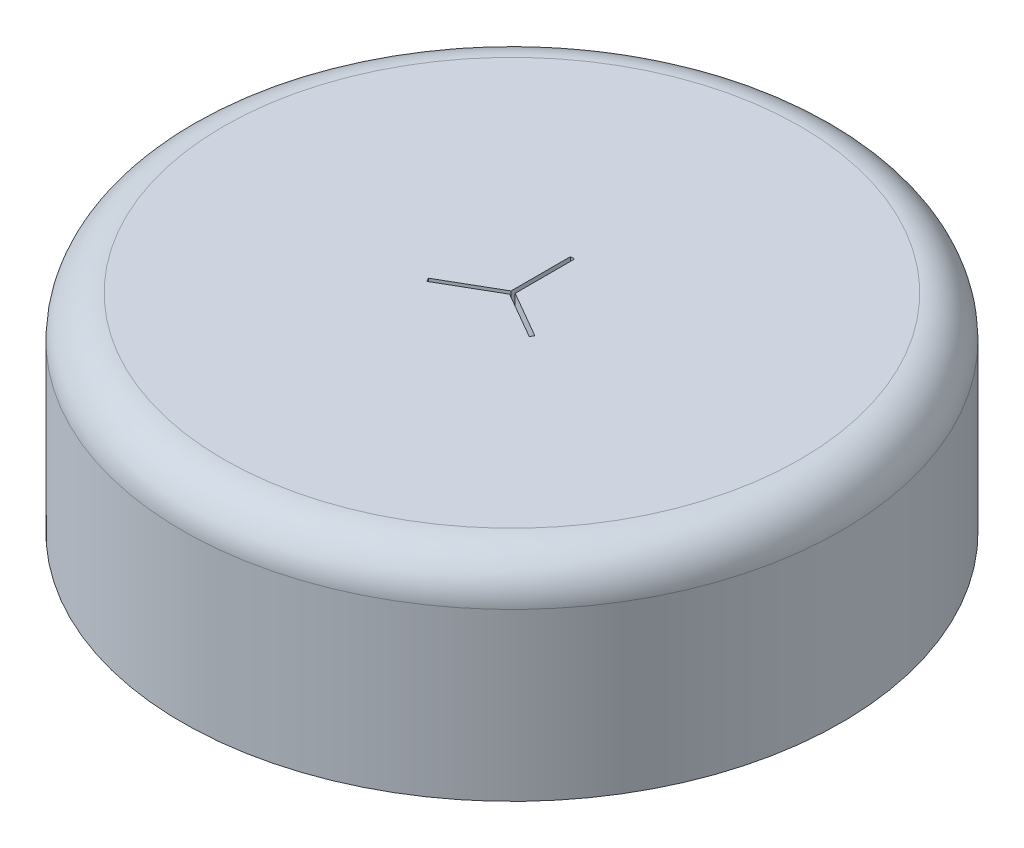
ISO-10303-21;
HEADER;
FILE_DESCRIPTION(('STEP AP214'),'2;1');
FILE_NAME('part.step','',(''),(''),'','','');
FILE_SCHEMA(('AUTOMOTIVE_DESIGN { 1 0 10303 214 1 1 1 1 }'));
ENDSEC;
DATA;
#1=APPLICATION_CONTEXT('core data for automotive mechanical design processes');
#2=APPLICATION_PROTOCOL_DEFINITION('international standard','automotive_design',2000,#1);
#3=PRODUCT_CONTEXT('',#1,'mechanical');
#4=PRODUCT('Part','Part','',(#3));
#5=PRODUCT_RELATED_PRODUCT_CATEGORY('part','',(#4));
#6=PRODUCT_DEFINITION_FORMATION('','',#4);
#7=PRODUCT_DEFINITION_CONTEXT('part definition',#1,'design');
#8=PRODUCT_DEFINITION('design','',#6,#7);
#9=PRODUCT_DEFINITION_SHAPE('','',#8);
#10=(LENGTH_UNIT() NAMED_UNIT(*) SI_UNIT(.MILLI.,.METRE.));
#11=(NAMED_UNIT(*) PLANE_ANGLE_UNIT() SI_UNIT($,.RADIAN.));
#12=(NAMED_UNIT(*) SI_UNIT($,.STERADIAN.) SOLID_ANGLE_UNIT());
#13=UNCERTAINTY_MEASURE_WITH_UNIT(LENGTH_MEASURE(1.E-05),#10,'distance_accuracy_value','');
#14=(GEOMETRIC_REPRESENTATION_CONTEXT(3) GLOBAL_UNCERTAINTY_ASSIGNED_CONTEXT((#13)) GLOBAL_UNIT_ASSIGNED_CONTEXT((#10,
#11,#12)) REPRESENTATION_CONTEXT('',''));
#15=CARTESIAN_POINT('',(0.,0.,0.));
#16=DIRECTION('',(0.,0.,1.));
#17=DIRECTION('',(1.,0.,0.));
#18=AXIS2_PLACEMENT_3D('',#15,#16,#17);
#19=CARTESIAN_POINT('',(0.,3.03981746358143,0.));
#20=DIRECTION('',(0.,-1.,0.));
#21=DIRECTION('',(0.,0.,-1.));
#22=AXIS2_PLACEMENT_3D('',#19,#20,#21);
#23=TOROIDAL_SURFACE('',#22,1.0253407245698,0.416650368106125);
#24=CARTESIAN_POINT('',(0.,3.25030742665386,0.));
#25=DIRECTION('',(0.,-1.,0.));
#26=DIRECTION('',(0.,0.,-1.));
#27=AXIS2_PLACEMENT_3D('',#24,#25,#26);
#28=CIRCLE('',#27,1.38491200357959);
#29=CARTESIAN_POINT('',(0.,3.25030742665386,-1.38491200357959));
#30=VERTEX_POINT('',#29);
#31=EDGE_CURVE('E226',#30,#30,#28,.T.);
#32=ORIENTED_EDGE('',*,*,#31,.T.);
#33=EDGE_LOOP('',(#32));
#34=FACE_BOUND('',#33,.T.);
#35=CARTESIAN_POINT('',(0.,3.45646783168756,0.));
#36=DIRECTION('',(0.,-1.,0.));
#37=DIRECTION('',(0.,0.,-1.));
#38=AXIS2_PLACEMENT_3D('',#35,#36,#37);
#39=CIRCLE('',#38,1.0253407245698);
#40=CARTESIAN_POINT('',(0.,3.45646783168756,-1.0253407245698));
#41=VERTEX_POINT('',#40);
#42=EDGE_CURVE('E167',#41,#41,#39,.T.);
#43=ORIENTED_EDGE('',*,*,#42,.F.);
#44=EDGE_LOOP('',(#43));
#45=FACE_BOUND('',#44,.T.);
#46=ADVANCED_FACE('F44',(#34,#45),#23,.F.);
#47=CARTESIAN_POINT('',(1.23240754185943,3.25030742665386,0.));
#48=DIRECTION('',(0.,1.,0.));
#49=DIRECTION('',(0.,0.,1.));
#50=AXIS2_PLACEMENT_3D('',#47,#48,#49);
#51=PLANE('',#50);
#52=CARTESIAN_POINT('',(0.,3.25030742665386,0.));
#53=DIRECTION('',(0.,-1.,0.));
#54=DIRECTION('',(0.,0.,-1.));
#55=AXIS2_PLACEMENT_3D('',#52,#53,#54);
#56=CIRCLE('',#55,1.23240754185943);
#57=CARTESIAN_POINT('',(0.,3.25030742665386,-1.23240754185943));
#58=VERTEX_POINT('',#57);
#59=EDGE_CURVE('E222',#58,#58,#56,.T.);
#60=ORIENTED_EDGE('',*,*,#59,.T.);
#61=EDGE_LOOP('',(#60));
#62=FACE_BOUND('',#61,.T.);
#63=ORIENTED_EDGE('',*,*,#31,.F.);
#64=EDGE_LOOP('',(#63));
#65=FACE_BOUND('',#64,.T.);
#66=ADVANCED_FACE('F369',(#62,#65),#51,.T.);
#67=CARTESIAN_POINT('',(0.,-6.03832645455052,0.));
#68=DIRECTION('',(0.,-1.,0.));
#69=DIRECTION('',(0.,0.,-1.));
#70=AXIS2_PLACEMENT_3D('',#67,#68,#69);
#71=CYLINDRICAL_SURFACE('',#70,1.23240754185943);
#72=CARTESIAN_POINT('',(0.,3.0336759454106,0.));
#73=DIRECTION('',(0.,-1.,0.));
#74=DIRECTION('',(0.,0.,-1.));
#75=AXIS2_PLACEMENT_3D('',#72,#73,#74);
#76=CIRCLE('',#75,1.23240754185943);
#77=CARTESIAN_POINT('',(0.,3.0336759454106,-1.23240754185943));
#78=VERTEX_POINT('',#77);
#79=EDGE_CURVE('E218',#78,#78,#76,.T.);
#80=ORIENTED_EDGE('',*,*,#79,.T.);
#81=EDGE_LOOP('',(#80));
#82=FACE_BOUND('',#81,.T.);
#83=ORIENTED_EDGE('',*,*,#59,.F.);
#84=EDGE_LOOP('',(#83));
#85=FACE_BOUND('',#84,.T.);
#86=ADVANCED_FACE('F374',(#82,#85),#71,.F.);
#87=CARTESIAN_POINT('',(1.23240754185943,3.0336759454106,0.));
#88=DIRECTION('',(0.,1.,0.));
#89=DIRECTION('',(0.,0.,1.));
#90=AXIS2_PLACEMENT_3D('',#87,#88,#89);
#91=PLANE('',#90);
#92=CARTESIAN_POINT('',(0.,3.0336759454106,0.));
#93=DIRECTION('',(0.,-1.,0.));
#94=DIRECTION('',(0.,0.,-1.));
#95=AXIS2_PLACEMENT_3D('',#92,#93,#94);
#96=CIRCLE('',#95,1.01706637065519);
#97=CARTESIAN_POINT('',(0.,3.0336759454106,-1.01706637065519));
#98=VERTEX_POINT('',#97);
#99=EDGE_CURVE('E214',#98,#98,#96,.T.);
#100=ORIENTED_EDGE('',*,*,#99,.T.);
#101=EDGE_LOOP('',(#100));
#102=FACE_BOUND('',#101,.T.);
#103=ORIENTED_EDGE('',*,*,#79,.F.);
#104=EDGE_LOOP('',(#103));
#105=FACE_BOUND('',#104,.T.);
#106=ADVANCED_FACE('F383',(#102,#105),#91,.T.);
#107=CARTESIAN_POINT('',(0.,-6.03832645455052,0.));
#108=DIRECTION('',(0.,-1.,0.));
#109=DIRECTION('',(0.,0.,-1.));
#110=AXIS2_PLACEMENT_3D('',#107,#108,#109);
#111=CYLINDRICAL_SURFACE('',#110,1.01706637065519);
#112=CARTESIAN_POINT('',(0.,2.86259760460049,0.));
#113=DIRECTION('',(0.,-1.,0.));
#114=DIRECTION('',(0.,0.,-1.));
#115=AXIS2_PLACEMENT_3D('',#112,#113,#114);
#116=CIRCLE('',#115,1.01706637065519);
#117=CARTESIAN_POINT('',(0.,2.86259760460049,-1.01706637065519));
#118=VERTEX_POINT('',#117);
#119=EDGE_CURVE('E210',#118,#118,#116,.T.);
#120=ORIENTED_EDGE('',*,*,#119,.T.);
#121=EDGE_LOOP('',(#120));
#122=FACE_BOUND('',#121,.T.);
#123=ORIENTED_EDGE('',*,*,#99,.F.);
#124=EDGE_LOOP('',(#123));
#125=FACE_BOUND('',#124,.T.);
#126=ADVANCED_FACE('F389',(#122,#125),#111,.F.);
#127=CARTESIAN_POINT('',(1.01706637065519,2.86259760460049,0.));
#128=DIRECTION('',(0.,-1.,0.));
#129=DIRECTION('',(0.,0.,-1.));
#130=AXIS2_PLACEMENT_3D('',#127,#128,#129);
#131=PLANE('',#130);
#132=CARTESIAN_POINT('',(0.,2.86259760460049,0.));
#133=DIRECTION('',(0.,-1.,0.));
#134=DIRECTION('',(0.,0.,-1.));
#135=AXIS2_PLACEMENT_3D('',#132,#133,#134);
#136=CIRCLE('',#135,1.4);
#137=CARTESIAN_POINT('',(0.,2.86259760460049,-1.4));
#138=VERTEX_POINT('',#137);
#139=EDGE_CURVE('E206',#138,#138,#136,.T.);
#140=ORIENTED_EDGE('',*,*,#139,.T.);
#141=EDGE_LOOP('',(#140));
#142=FACE_BOUND('',#141,.T.);
#143=ORIENTED_EDGE('',*,*,#119,.F.);
#144=EDGE_LOOP('',(#143));
#145=FACE_BOUND('',#144,.T.);
#146=ADVANCED_FACE('F393',(#142,#145),#131,.T.);
#147=CARTESIAN_POINT('',(0.,-6.03832645455052,0.));
#148=DIRECTION('',(0.,-1.,0.));
#149=DIRECTION('',(0.,0.,-1.));
#150=AXIS2_PLACEMENT_3D('',#147,#148,#149);
#151=CYLINDRICAL_SURFACE('',#150,1.4);
#152=CARTESIAN_POINT('',(0.,2.52950090231482,0.));
#153=DIRECTION('',(0.,-1.,0.));
#154=DIRECTION('',(0.,0.,-1.));
#155=AXIS2_PLACEMENT_3D('',#152,#153,#154);
#156=CIRCLE('',#155,1.4);
#157=CARTESIAN_POINT('',(0.,2.52950090231482,-1.4));
#158=VERTEX_POINT('',#157);
#159=EDGE_CURVE('E202',#158,#158,#156,.T.);
#160=ORIENTED_EDGE('',*,*,#159,.T.);
#161=EDGE_LOOP('',(#160));
#162=FACE_BOUND('',#161,.T.);
#163=ORIENTED_EDGE('',*,*,#139,.F.);
#164=EDGE_LOOP('',(#163));
#165=FACE_BOUND('',#164,.T.);
#166=ADVANCED_FACE('F397',(#162,#165),#151,.F.);
#167=CARTESIAN_POINT('',(1.4,2.52950090231482,0.));
#168=DIRECTION('',(0.,-1.,0.));
#169=DIRECTION('',(0.,0.,-1.));
#170=AXIS2_PLACEMENT_3D('',#167,#168,#169);
#171=PLANE('',#170);
#172=CARTESIAN_POINT('',(0.,2.52950090231482,0.));
#173=DIRECTION('',(0.,-1.,0.));
#174=DIRECTION('',(0.,0.,-1.));
#175=AXIS2_PLACEMENT_3D('',#172,#173,#174);
#176=CIRCLE('',#175,1.6);
#177=CARTESIAN_POINT('',(0.,2.52950090231482,-1.6));
#178=VERTEX_POINT('',#177);
#179=EDGE_CURVE('E198',#178,#178,#176,.T.);
#180=ORIENTED_EDGE('',*,*,#179,.T.);
#181=EDGE_LOOP('',(#180));
#182=FACE_BOUND('',#181,.T.);
#183=ORIENTED_EDGE('',*,*,#159,.F.);
#184=EDGE_LOOP('',(#183));
#185=FACE_BOUND('',#184,.T.);
#186=ADVANCED_FACE('F401',(#182,#185),#171,.T.);
#187=CARTESIAN_POINT('',(0.,-6.03832645455052,0.));
#188=DIRECTION('',(0.,-1.,0.));
#189=DIRECTION('',(0.,0.,-1.));
#190=AXIS2_PLACEMENT_3D('',#187,#188,#189);
#191=CYLINDRICAL_SURFACE('',#190,1.6);
#192=CARTESIAN_POINT('',(0.,3.33646783168756,0.));
#193=DIRECTION('',(0.,-1.,0.));
#194=DIRECTION('',(0.,0.,-1.));
#195=AXIS2_PLACEMENT_3D('',#192,#193,#194);
#196=CIRCLE('',#195,1.6);
#197=CARTESIAN_POINT('',(0.,3.33646783168756,-1.6));
#198=VERTEX_POINT('',#197);
#199=EDGE_CURVE('E194',#198,#198,#196,.T.);
#200=ORIENTED_EDGE('',*,*,#199,.T.);
#201=EDGE_LOOP('',(#200));
#202=FACE_BOUND('',#201,.T.);
#203=ORIENTED_EDGE('',*,*,#179,.F.);
#204=EDGE_LOOP('',(#203));
#205=FACE_BOUND('',#204,.T.);
#206=ADVANCED_FACE('F405',(#202,#205),#191,.T.);
#207=CARTESIAN_POINT('',(0.,3.33646783168756,0.));
#208=DIRECTION('',(0.,-1.,0.));
#209=DIRECTION('',(0.,0.,-1.));
#210=AXIS2_PLACEMENT_3D('',#207,#208,#209);
#211=TOROIDAL_SURFACE('',#210,1.4,0.2);
#212=CARTESIAN_POINT('',(0.,3.53646783168756,0.));
#213=DIRECTION('',(0.,-1.,0.));
#214=DIRECTION('',(0.,0.,-1.));
#215=AXIS2_PLACEMENT_3D('',#212,#213,#214);
#216=CIRCLE('',#215,1.4);
#217=CARTESIAN_POINT('',(0.,3.53646783168756,-1.4));
#218=VERTEX_POINT('',#217);
#219=EDGE_CURVE('E190',#218,#218,#216,.T.);
#220=ORIENTED_EDGE('',*,*,#219,.T.);
#221=EDGE_LOOP('',(#220));
#222=FACE_BOUND('',#221,.T.);
#223=ORIENTED_EDGE('',*,*,#199,.F.);
#224=EDGE_LOOP('',(#223));
#225=FACE_BOUND('',#224,.T.);
#226=ADVANCED_FACE('F409',(#222,#225),#211,.T.);
#227=CARTESIAN_POINT('',(1.4,3.53646783168756,0.));
#228=DIRECTION('',(0.,1.,0.));
#229=DIRECTION('',(0.,0.,1.));
#230=AXIS2_PLACEMENT_3D('',#227,#228,#229);
#231=PLANE('',#230);
#232=DIRECTION('',(-0.866025403784443,0.,0.499999999999992));
#233=VECTOR('',#232,1.);
#234=CARTESIAN_POINT('',(-0.01,3.53646783168756,-0.00577350269189632));
#235=LINE('',#234,#233);
#236=CARTESIAN_POINT('',(-0.01,3.53646783168756,-0.00577350269189632));
#237=VERTEX_POINT('',#236);
#238=CARTESIAN_POINT('',(-0.264294351154463,3.53646783168756,0.141043409400531));
#239=VERTEX_POINT('',#238);
#240=EDGE_CURVE('E59',#237,#239,#235,.T.);
#241=ORIENTED_EDGE('',*,*,#240,.F.);
#242=DIRECTION('',(0.,0.,1.));
#243=VECTOR('',#242,1.);
#244=CARTESIAN_POINT('',(-0.01,3.53646783168756,-0.00577350269189632));
#245=LINE('',#244,#243);
#246=CARTESIAN_POINT('',(-0.01,3.53646783168756,-0.294280869093366));
#247=VERTEX_POINT('',#246);
#248=EDGE_CURVE('E161',#247,#237,#245,.T.);
#249=ORIENTED_EDGE('',*,*,#248,.F.);
#250=DIRECTION('',(-1.,0.,0.));
#251=VECTOR('',#250,1.);
#252=CARTESIAN_POINT('',(0.01,3.53646783168756,-0.294280869093366));
#253=LINE('',#252,#251);
#254=CARTESIAN_POINT('',(0.01,3.53646783168756,-0.294280869093366));
#255=VERTEX_POINT('',#254);
#256=EDGE_CURVE('E158',#255,#247,#253,.T.);
#257=ORIENTED_EDGE('',*,*,#256,.F.);
#258=DIRECTION('',(0.,0.,-1.));
#259=VECTOR('',#258,1.);
#260=CARTESIAN_POINT('',(0.01,3.53646783168756,-0.00577350269189623));
#261=LINE('',#260,#259);
#262=CARTESIAN_POINT('',(0.01,3.53646783168756,-0.00577350269189623));
#263=VERTEX_POINT('',#262);
#264=EDGE_CURVE('E154',#263,#255,#261,.T.);
#265=ORIENTED_EDGE('',*,*,#264,.F.);
#266=DIRECTION('',(-0.866025403784436,0.,-0.500000000000004));
#267=VECTOR('',#266,1.);
#268=CARTESIAN_POINT('',(0.01,3.53646783168756,-0.00577350269189623));
#269=LINE('',#268,#267);
#270=CARTESIAN_POINT('',(0.236087164419093,3.53646783168756,0.124757982545788));
#271=VERTEX_POINT('',#270);
#272=EDGE_CURVE('E150',#271,#263,#269,.T.);
#273=ORIENTED_EDGE('',*,*,#272,.F.);
#274=DIRECTION('',(0.500000000000003,0.,-0.866025403784437));
#275=VECTOR('',#274,1.);
#276=CARTESIAN_POINT('',(0.226087164419093,3.53646783168756,0.142078490621476));
#277=LINE('',#276,#275);
#278=CARTESIAN_POINT('',(0.226087164419093,3.53646783168756,0.142078490621476));
#279=VERTEX_POINT('',#278);
#280=EDGE_CURVE('E143',#279,#271,#277,.T.);
#281=ORIENTED_EDGE('',*,*,#280,.F.);
#282=DIRECTION('',(0.866025403784436,0.,0.500000000000004));
#283=VECTOR('',#282,1.);
#284=CARTESIAN_POINT('',(0.,3.53646783168756,0.0115470053837925));
#285=LINE('',#284,#283);
#286=CARTESIAN_POINT('',(0.,3.53646783168756,0.0115470053837925));
#287=VERTEX_POINT('',#286);
#288=EDGE_CURVE('E136',#287,#279,#285,.T.);
#289=ORIENTED_EDGE('',*,*,#288,.F.);
#290=DIRECTION('',(0.866025403784443,0.,-0.499999999999992));
#291=VECTOR('',#290,1.);
#292=CARTESIAN_POINT('',(0.,3.53646783168756,0.0115470053837925));
#293=LINE('',#292,#291);
#294=CARTESIAN_POINT('',(-0.254294351154463,3.53646783168756,0.15836391747622));
#295=VERTEX_POINT('',#294);
#296=EDGE_CURVE('E117',#295,#287,#293,.T.);
#297=ORIENTED_EDGE('',*,*,#296,.F.);
#298=DIRECTION('',(0.499999999999986,0.,0.866025403784447));
#299=VECTOR('',#298,1.);
#300=CARTESIAN_POINT('',(-0.264294351154463,3.53646783168756,0.141043409400531));
#301=LINE('',#300,#299);
#302=EDGE_CURVE('E127',#239,#295,#301,.T.);
#303=ORIENTED_EDGE('',*,*,#302,.F.);
#304=EDGE_LOOP('',(#241,#249,#257,#265,#273,#281,#289,#297,#303));
#305=FACE_BOUND('',#304,.T.);
#306=ORIENTED_EDGE('',*,*,#219,.F.);
#307=EDGE_LOOP('',(#306));
#308=FACE_BOUND('',#307,.T.);
#309=ADVANCED_FACE('F132',(#305,#308),#231,.T.);
#310=CARTESIAN_POINT('',(0.,3.45646783168756,0.));
#311=DIRECTION('',(0.,-1.,0.));
#312=DIRECTION('',(0.,0.,-1.));
#313=AXIS2_PLACEMENT_3D('',#310,#311,#312);
#314=PLANE('',#313);
#315=DIRECTION('',(0.866025403784443,0.,-0.499999999999992));
#316=VECTOR('',#315,1.);
#317=CARTESIAN_POINT('',(-0.00500000000000006,3.45646783168756,-0.00866025403784435));
#318=LINE('',#317,#316);
#319=CARTESIAN_POINT('',(-0.264294351154463,3.45646783168756,0.141043409400531));
#320=VERTEX_POINT('',#319);
#321=CARTESIAN_POINT('',(-0.01,3.45646783168756,-0.00577350269189632));
#322=VERTEX_POINT('',#321);
#323=EDGE_CURVE('E11',#320,#322,#318,.T.);
#324=ORIENTED_EDGE('',*,*,#323,.F.);
#325=DIRECTION('',(-0.499999999999986,0.,-0.866025403784447));
#326=VECTOR('',#325,1.);
#327=CARTESIAN_POINT('',(-0.259294351154464,3.45646783168756,0.149703663438374));
#328=LINE('',#327,#326);
#329=CARTESIAN_POINT('',(-0.254294351154463,3.45646783168756,0.15836391747622));
#330=VERTEX_POINT('',#329);
#331=EDGE_CURVE('E230',#330,#320,#328,.T.);
#332=ORIENTED_EDGE('',*,*,#331,.F.);
#333=DIRECTION('',(-0.866025403784443,0.,0.499999999999992));
#334=VECTOR('',#333,1.);
#335=CARTESIAN_POINT('',(0.00499999999999978,3.45646783168756,0.00866025403784451));
#336=LINE('',#335,#334);
#337=CARTESIAN_POINT('',(0.,3.45646783168756,0.0115470053837925));
#338=VERTEX_POINT('',#337);
#339=EDGE_CURVE('E120',#338,#330,#336,.T.);
#340=ORIENTED_EDGE('',*,*,#339,.F.);
#341=DIRECTION('',(-0.866025403784436,0.,-0.500000000000004));
#342=VECTOR('',#341,1.);
#343=CARTESIAN_POINT('',(-0.00500000000000018,3.45646783168756,0.00866025403784428));
#344=LINE('',#343,#342);
#345=CARTESIAN_POINT('',(0.226087164419093,3.45646783168756,0.142078490621476));
#346=VERTEX_POINT('',#345);
#347=EDGE_CURVE('E235',#346,#338,#344,.T.);
#348=ORIENTED_EDGE('',*,*,#347,.F.);
#349=DIRECTION('',(-0.500000000000003,0.,0.866025403784437));
#350=VECTOR('',#349,1.);
#351=CARTESIAN_POINT('',(0.231087164419093,3.45646783168756,0.133418236583632));
#352=LINE('',#351,#350);
#353=CARTESIAN_POINT('',(0.236087164419093,3.45646783168756,0.124757982545788));
#354=VERTEX_POINT('',#353);
#355=EDGE_CURVE('E238',#354,#346,#352,.T.);
#356=ORIENTED_EDGE('',*,*,#355,.F.);
#357=DIRECTION('',(0.866025403784436,0.,0.500000000000004));
#358=VECTOR('',#357,1.);
#359=CARTESIAN_POINT('',(0.0049999999999999,3.45646783168756,-0.00866025403784445));
#360=LINE('',#359,#358);
#361=CARTESIAN_POINT('',(0.01,3.45646783168756,-0.00577350269189623));
#362=VERTEX_POINT('',#361);
#363=EDGE_CURVE('E241',#362,#354,#360,.T.);
#364=ORIENTED_EDGE('',*,*,#363,.F.);
#365=DIRECTION('',(0.,0.,1.));
#366=VECTOR('',#365,1.);
#367=CARTESIAN_POINT('',(0.01,3.45646783168756,0.));
#368=LINE('',#367,#366);
#369=CARTESIAN_POINT('',(0.01,3.45646783168756,-0.294280869093366));
#370=VERTEX_POINT('',#369);
#371=EDGE_CURVE('E244',#370,#362,#368,.T.);
#372=ORIENTED_EDGE('',*,*,#371,.F.);
#373=DIRECTION('',(1.,0.,0.));
#374=VECTOR('',#373,1.);
#375=CARTESIAN_POINT('',(0.,3.45646783168756,-0.294280869093366));
#376=LINE('',#375,#374);
#377=CARTESIAN_POINT('',(-0.01,3.45646783168756,-0.294280869093366));
#378=VERTEX_POINT('',#377);
#379=EDGE_CURVE('E247',#378,#370,#376,.T.);
#380=ORIENTED_EDGE('',*,*,#379,.F.);
#381=DIRECTION('',(0.,0.,-1.));
#382=VECTOR('',#381,1.);
#383=CARTESIAN_POINT('',(-0.01,3.45646783168756,0.));
#384=LINE('',#383,#382);
#385=EDGE_CURVE('E52',#322,#378,#384,.T.);
#386=ORIENTED_EDGE('',*,*,#385,.F.);
#387=EDGE_LOOP('',(#324,#332,#340,#348,#356,#364,#372,#380,#386));
#388=FACE_BOUND('',#387,.T.);
#389=ORIENTED_EDGE('',*,*,#42,.T.);
#390=EDGE_LOOP('',(#389));
#391=FACE_BOUND('',#390,.T.);
#392=ADVANCED_FACE('F265',(#388,#391),#314,.T.);
#393=CARTESIAN_POINT('',(-0.01,-1.46353216831244,-0.00577350269189632));
#394=DIRECTION('',(-0.499999999999992,0.,-0.866025403784443));
#395=DIRECTION('',(-0.866025403784443,0.,0.499999999999992));
#396=AXIS2_PLACEMENT_3D('',#393,#394,#395);
#397=PLANE('',#396);
#398=ORIENTED_EDGE('',*,*,#323,.T.);
#399=DIRECTION('',(0.,1.,0.));
#400=VECTOR('',#399,1.);
#401=CARTESIAN_POINT('',(-0.01,-1.46353216831244,-0.00577350269189632));
#402=LINE('',#401,#400);
#403=EDGE_CURVE('E165',#322,#237,#402,.T.);
#404=ORIENTED_EDGE('',*,*,#403,.T.);
#405=ORIENTED_EDGE('',*,*,#240,.T.);
#406=DIRECTION('',(0.,1.,0.));
#407=VECTOR('',#406,1.);
#408=CARTESIAN_POINT('',(-0.264294351154463,-1.46353216831244,0.141043409400531));
#409=LINE('',#408,#407);
#410=EDGE_CURVE('E124',#320,#239,#409,.T.);
#411=ORIENTED_EDGE('',*,*,#410,.F.);
#412=EDGE_LOOP('',(#398,#404,#405,#411));
#413=FACE_BOUND('',#412,.T.);
#414=ADVANCED_FACE('F358',(#413),#397,.F.);
#415=CARTESIAN_POINT('',(-0.01,-1.46353216831244,-0.00577350269189632));
#416=DIRECTION('',(-1.,0.,0.));
#417=DIRECTION('',(0.,0.,1.));
#418=AXIS2_PLACEMENT_3D('',#415,#416,#417);
#419=PLANE('',#418);
#420=ORIENTED_EDGE('',*,*,#385,.T.);
#421=DIRECTION('',(0.,1.,0.));
#422=VECTOR('',#421,1.);
#423=CARTESIAN_POINT('',(-0.01,-1.46353216831244,-0.294280869093366));
#424=LINE('',#423,#422);
#425=EDGE_CURVE('E168',#378,#247,#424,.T.);
#426=ORIENTED_EDGE('',*,*,#425,.T.);
#427=ORIENTED_EDGE('',*,*,#248,.T.);
#428=ORIENTED_EDGE('',*,*,#403,.F.);
#429=EDGE_LOOP('',(#420,#426,#427,#428));
#430=FACE_BOUND('',#429,.T.);
#431=ADVANCED_FACE('F255',(#430),#419,.F.);
#432=CARTESIAN_POINT('',(0.01,-1.46353216831244,-0.294280869093366));
#433=DIRECTION('',(0.,0.,-1.));
#434=DIRECTION('',(-1.,0.,0.));
#435=AXIS2_PLACEMENT_3D('',#432,#433,#434);
#436=PLANE('',#435);
#437=ORIENTED_EDGE('',*,*,#379,.T.);
#438=DIRECTION('',(0.,1.,0.));
#439=VECTOR('',#438,1.);
#440=CARTESIAN_POINT('',(0.01,-1.46353216831244,-0.294280869093366));
#441=LINE('',#440,#439);
#442=EDGE_CURVE('E171',#370,#255,#441,.T.);
#443=ORIENTED_EDGE('',*,*,#442,.T.);
#444=ORIENTED_EDGE('',*,*,#256,.T.);
#445=ORIENTED_EDGE('',*,*,#425,.F.);
#446=EDGE_LOOP('',(#437,#443,#444,#445));
#447=FACE_BOUND('',#446,.T.);
#448=ADVANCED_FACE('F260',(#447),#436,.F.);
#449=CARTESIAN_POINT('',(0.01,-1.46353216831244,-0.00577350269189623));
#450=DIRECTION('',(1.,0.,0.));
#451=DIRECTION('',(0.,0.,-1.));
#452=AXIS2_PLACEMENT_3D('',#449,#450,#451);
#453=PLANE('',#452);
#454=ORIENTED_EDGE('',*,*,#371,.T.);
#455=DIRECTION('',(0.,1.,0.));
#456=VECTOR('',#455,1.);
#457=CARTESIAN_POINT('',(0.01,-1.46353216831244,-0.00577350269189623));
#458=LINE('',#457,#456);
#459=EDGE_CURVE('E174',#362,#263,#458,.T.);
#460=ORIENTED_EDGE('',*,*,#459,.T.);
#461=ORIENTED_EDGE('',*,*,#264,.T.);
#462=ORIENTED_EDGE('',*,*,#442,.F.);
#463=EDGE_LOOP('',(#454,#460,#461,#462));
#464=FACE_BOUND('',#463,.T.);
#465=ADVANCED_FACE('F271',(#464),#453,.F.);
#466=CARTESIAN_POINT('',(0.01,-1.46353216831244,-0.00577350269189623));
#467=DIRECTION('',(0.500000000000004,0.,-0.866025403784436));
#468=DIRECTION('',(-0.866025403784436,0.,-0.500000000000004));
#469=AXIS2_PLACEMENT_3D('',#466,#467,#468);
#470=PLANE('',#469);
#471=ORIENTED_EDGE('',*,*,#363,.T.);
#472=DIRECTION('',(0.,1.,0.));
#473=VECTOR('',#472,1.);
#474=CARTESIAN_POINT('',(0.236087164419093,-1.46353216831244,0.124757982545788));
#475=LINE('',#474,#473);
#476=EDGE_CURVE('E177',#354,#271,#475,.T.);
#477=ORIENTED_EDGE('',*,*,#476,.T.);
#478=ORIENTED_EDGE('',*,*,#272,.T.);
#479=ORIENTED_EDGE('',*,*,#459,.F.);
#480=EDGE_LOOP('',(#471,#477,#478,#479));
#481=FACE_BOUND('',#480,.T.);
#482=ADVANCED_FACE('F273',(#481),#470,.F.);
#483=CARTESIAN_POINT('',(0.226087164419093,-1.46353216831244,0.142078490621476));
#484=DIRECTION('',(0.866025403784437,0.,0.500000000000003));
#485=DIRECTION('',(0.500000000000003,0.,-0.866025403784437));
#486=AXIS2_PLACEMENT_3D('',#483,#484,#485);
#487=PLANE('',#486);
#488=ORIENTED_EDGE('',*,*,#355,.T.);
#489=DIRECTION('',(0.,1.,0.));
#490=VECTOR('',#489,1.);
#491=CARTESIAN_POINT('',(0.226087164419093,-1.46353216831244,0.142078490621476));
#492=LINE('',#491,#490);
#493=EDGE_CURVE('E180',#346,#279,#492,.T.);
#494=ORIENTED_EDGE('',*,*,#493,.T.);
#495=ORIENTED_EDGE('',*,*,#280,.T.);
#496=ORIENTED_EDGE('',*,*,#476,.F.);
#497=EDGE_LOOP('',(#488,#494,#495,#496));
#498=FACE_BOUND('',#497,.T.);
#499=ADVANCED_FACE('F353',(#498),#487,.F.);
#500=CARTESIAN_POINT('',(0.,-1.46353216831244,0.0115470053837925));
#501=DIRECTION('',(-0.500000000000004,0.,0.866025403784436));
#502=DIRECTION('',(0.866025403784436,0.,0.500000000000004));
#503=AXIS2_PLACEMENT_3D('',#500,#501,#502);
#504=PLANE('',#503);
#505=ORIENTED_EDGE('',*,*,#347,.T.);
#506=DIRECTION('',(0.,1.,0.));
#507=VECTOR('',#506,1.);
#508=CARTESIAN_POINT('',(0.,-1.46353216831244,0.0115470053837925));
#509=LINE('',#508,#507);
#510=EDGE_CURVE('E123',#338,#287,#509,.T.);
#511=ORIENTED_EDGE('',*,*,#510,.T.);
#512=ORIENTED_EDGE('',*,*,#288,.T.);
#513=ORIENTED_EDGE('',*,*,#493,.F.);
#514=EDGE_LOOP('',(#505,#511,#512,#513));
#515=FACE_BOUND('',#514,.T.);
#516=ADVANCED_FACE('F357',(#515),#504,.F.);
#517=CARTESIAN_POINT('',(0.,-1.46353216831244,0.0115470053837925));
#518=DIRECTION('',(0.499999999999992,0.,0.866025403784443));
#519=DIRECTION('',(0.866025403784443,0.,-0.499999999999992));
#520=AXIS2_PLACEMENT_3D('',#517,#518,#519);
#521=PLANE('',#520);
#522=ORIENTED_EDGE('',*,*,#339,.T.);
#523=DIRECTION('',(0.,1.,0.));
#524=VECTOR('',#523,1.);
#525=CARTESIAN_POINT('',(-0.254294351154463,-1.46353216831244,0.15836391747622));
#526=LINE('',#525,#524);
#527=EDGE_CURVE('E67',#330,#295,#526,.T.);
#528=ORIENTED_EDGE('',*,*,#527,.T.);
#529=ORIENTED_EDGE('',*,*,#296,.T.);
#530=ORIENTED_EDGE('',*,*,#510,.F.);
#531=EDGE_LOOP('',(#522,#528,#529,#530));
#532=FACE_BOUND('',#531,.T.);
#533=ADVANCED_FACE('F114',(#532),#521,.F.);
#534=CARTESIAN_POINT('',(-0.264294351154463,-1.46353216831244,0.141043409400531));
#535=DIRECTION('',(-0.866025403784447,0.,0.499999999999986));
#536=DIRECTION('',(0.499999999999986,0.,0.866025403784447));
#537=AXIS2_PLACEMENT_3D('',#534,#535,#536);
#538=PLANE('',#537);
#539=ORIENTED_EDGE('',*,*,#331,.T.);
#540=ORIENTED_EDGE('',*,*,#410,.T.);
#541=ORIENTED_EDGE('',*,*,#302,.T.);
#542=ORIENTED_EDGE('',*,*,#527,.F.);
#543=EDGE_LOOP('',(#539,#540,#541,#542));
#544=FACE_BOUND('',#543,.T.);
#545=ADVANCED_FACE('F128',(#544),#538,.F.);
#546=CLOSED_SHELL('',(#46,#66,#86,#106,#126,#146,#166,#186,#206,#226,#309,#392,#414,#431,#448,
#465,#482,#499,#516,#533,#545));
#547=MANIFOLD_SOLID_BREP('B2',#546);
#548=ADVANCED_BREP_SHAPE_REPRESENTATION('',(#18,#547),#14);
#549=SHAPE_DEFINITION_REPRESENTATION(#9,#548);
ENDSEC;
END-ISO-10303-21;
